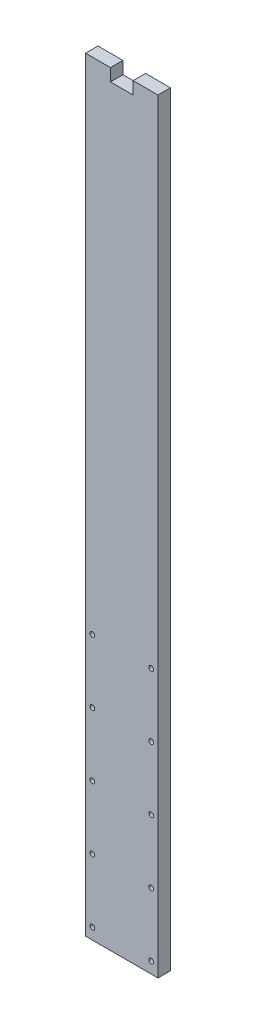
ISO-10303-21;
HEADER;
FILE_DESCRIPTION(('STEP AP214'),'2;1');
FILE_NAME('part.step','',(''),(''),'','','');
FILE_SCHEMA(('AUTOMOTIVE_DESIGN { 1 0 10303 214 1 1 1 1 }'));
ENDSEC;
DATA;
#1=APPLICATION_CONTEXT('core data for automotive mechanical design processes');
#2=APPLICATION_PROTOCOL_DEFINITION('international standard','automotive_design',2000,#1);
#3=PRODUCT_CONTEXT('',#1,'mechanical');
#4=PRODUCT('Part','Part','',(#3));
#5=PRODUCT_RELATED_PRODUCT_CATEGORY('part','',(#4));
#6=PRODUCT_DEFINITION_FORMATION('','',#4);
#7=PRODUCT_DEFINITION_CONTEXT('part definition',#1,'design');
#8=PRODUCT_DEFINITION('design','',#6,#7);
#9=PRODUCT_DEFINITION_SHAPE('','',#8);
#10=(LENGTH_UNIT() NAMED_UNIT(*) SI_UNIT(.MILLI.,.METRE.));
#11=(NAMED_UNIT(*) PLANE_ANGLE_UNIT() SI_UNIT($,.RADIAN.));
#12=(NAMED_UNIT(*) SI_UNIT($,.STERADIAN.) SOLID_ANGLE_UNIT());
#13=UNCERTAINTY_MEASURE_WITH_UNIT(LENGTH_MEASURE(1.E-05),#10,'distance_accuracy_value','');
#14=(GEOMETRIC_REPRESENTATION_CONTEXT(3) GLOBAL_UNCERTAINTY_ASSIGNED_CONTEXT((#13)) GLOBAL_UNIT_ASSIGNED_CONTEXT((#10,
#11,#12)) REPRESENTATION_CONTEXT('',''));
#15=CARTESIAN_POINT('',(0.,0.,0.));
#16=DIRECTION('',(0.,0.,1.));
#17=DIRECTION('',(1.,0.,0.));
#18=AXIS2_PLACEMENT_3D('',#15,#16,#17);
#19=CARTESIAN_POINT('',(0.,338.,5.5));
#20=DIRECTION('',(0.,-1.,0.));
#21=DIRECTION('',(0.,0.,-1.));
#22=AXIS2_PLACEMENT_3D('',#19,#20,#21);
#23=PLANE('',#22);
#24=DIRECTION('',(-1.,0.,0.));
#25=VECTOR('',#24,1.);
#26=CARTESIAN_POINT('',(0.,338.,0.));
#27=LINE('',#26,#25);
#28=CARTESIAN_POINT('',(32.,338.,0.));
#29=VERTEX_POINT('',#28);
#30=CARTESIAN_POINT('',(20.9999999999999,338.,0.));
#31=VERTEX_POINT('',#30);
#32=EDGE_CURVE('E126',#29,#31,#27,.T.);
#33=ORIENTED_EDGE('',*,*,#32,.T.);
#34=DIRECTION('',(0.,0.,1.));
#35=VECTOR('',#34,1.);
#36=CARTESIAN_POINT('',(20.9999999999999,338.,0.));
#37=LINE('',#36,#35);
#38=CARTESIAN_POINT('',(20.9999999999999,338.,5.5));
#39=VERTEX_POINT('',#38);
#40=EDGE_CURVE('E110',#31,#39,#37,.T.);
#41=ORIENTED_EDGE('',*,*,#40,.T.);
#42=DIRECTION('',(-1.,0.,0.));
#43=VECTOR('',#42,1.);
#44=CARTESIAN_POINT('',(0.,338.,5.5));
#45=LINE('',#44,#43);
#46=CARTESIAN_POINT('',(32.,338.,5.5));
#47=VERTEX_POINT('',#46);
#48=EDGE_CURVE('E143',#47,#39,#45,.T.);
#49=ORIENTED_EDGE('',*,*,#48,.F.);
#50=DIRECTION('',(0.,0.,-1.));
#51=VECTOR('',#50,1.);
#52=CARTESIAN_POINT('',(32.,338.,5.5));
#53=LINE('',#52,#51);
#54=EDGE_CURVE('E133',#47,#29,#53,.T.);
#55=ORIENTED_EDGE('',*,*,#54,.T.);
#56=EDGE_LOOP('',(#33,#41,#49,#55));
#57=FACE_BOUND('',#56,.T.);
#58=ADVANCED_FACE('F33',(#57),#23,.F.);
#59=CARTESIAN_POINT('',(0.,0.,5.5));
#60=DIRECTION('',(1.,0.,0.));
#61=DIRECTION('',(0.,0.,-1.));
#62=AXIS2_PLACEMENT_3D('',#59,#60,#61);
#63=PLANE('',#62);
#64=DIRECTION('',(0.,-1.,0.));
#65=VECTOR('',#64,1.);
#66=CARTESIAN_POINT('',(0.,0.,0.));
#67=LINE('',#66,#65);
#68=CARTESIAN_POINT('',(0.,338.,0.));
#69=VERTEX_POINT('',#68);
#70=CARTESIAN_POINT('',(0.,0.,0.));
#71=VERTEX_POINT('',#70);
#72=EDGE_CURVE('E189',#69,#71,#67,.T.);
#73=ORIENTED_EDGE('',*,*,#72,.T.);
#74=DIRECTION('',(0.,0.,-1.));
#75=VECTOR('',#74,1.);
#76=CARTESIAN_POINT('',(0.,0.,5.5));
#77=LINE('',#76,#75);
#78=CARTESIAN_POINT('',(0.,0.,5.5));
#79=VERTEX_POINT('',#78);
#80=EDGE_CURVE('E11',#79,#71,#77,.T.);
#81=ORIENTED_EDGE('',*,*,#80,.F.);
#82=DIRECTION('',(0.,-1.,0.));
#83=VECTOR('',#82,1.);
#84=CARTESIAN_POINT('',(0.,0.,5.5));
#85=LINE('',#84,#83);
#86=CARTESIAN_POINT('',(0.,338.,5.5));
#87=VERTEX_POINT('',#86);
#88=EDGE_CURVE('E134',#87,#79,#85,.T.);
#89=ORIENTED_EDGE('',*,*,#88,.F.);
#90=DIRECTION('',(0.,0.,-1.));
#91=VECTOR('',#90,1.);
#92=CARTESIAN_POINT('',(0.,338.,5.5));
#93=LINE('',#92,#91);
#94=EDGE_CURVE('E141',#87,#69,#93,.T.);
#95=ORIENTED_EDGE('',*,*,#94,.T.);
#96=EDGE_LOOP('',(#73,#81,#89,#95));
#97=FACE_BOUND('',#96,.T.);
#98=ADVANCED_FACE('F35',(#97),#63,.F.);
#99=CARTESIAN_POINT('',(0.,0.,5.5));
#100=DIRECTION('',(0.,1.,0.));
#101=DIRECTION('',(0.,0.,1.));
#102=AXIS2_PLACEMENT_3D('',#99,#100,#101);
#103=PLANE('',#102);
#104=DIRECTION('',(1.,0.,0.));
#105=VECTOR('',#104,1.);
#106=CARTESIAN_POINT('',(0.,0.,0.));
#107=LINE('',#106,#105);
#108=CARTESIAN_POINT('',(32.,0.,0.));
#109=VERTEX_POINT('',#108);
#110=EDGE_CURVE('E198',#71,#109,#107,.T.);
#111=ORIENTED_EDGE('',*,*,#110,.T.);
#112=DIRECTION('',(0.,0.,-1.));
#113=VECTOR('',#112,1.);
#114=CARTESIAN_POINT('',(32.,0.,5.5));
#115=LINE('',#114,#113);
#116=CARTESIAN_POINT('',(32.,0.,5.5));
#117=VERTEX_POINT('',#116);
#118=EDGE_CURVE('E42',#117,#109,#115,.T.);
#119=ORIENTED_EDGE('',*,*,#118,.F.);
#120=DIRECTION('',(1.,0.,0.));
#121=VECTOR('',#120,1.);
#122=CARTESIAN_POINT('',(0.,0.,5.5));
#123=LINE('',#122,#121);
#124=EDGE_CURVE('E88',#79,#117,#123,.T.);
#125=ORIENTED_EDGE('',*,*,#124,.F.);
#126=ORIENTED_EDGE('',*,*,#80,.T.);
#127=EDGE_LOOP('',(#111,#119,#125,#126));
#128=FACE_BOUND('',#127,.T.);
#129=ADVANCED_FACE('F204',(#128),#103,.F.);
#130=CARTESIAN_POINT('',(32.,0.,5.5));
#131=DIRECTION('',(-1.,0.,0.));
#132=DIRECTION('',(0.,0.,1.));
#133=AXIS2_PLACEMENT_3D('',#130,#131,#132);
#134=PLANE('',#133);
#135=DIRECTION('',(0.,1.,0.));
#136=VECTOR('',#135,1.);
#137=CARTESIAN_POINT('',(32.,0.,0.));
#138=LINE('',#137,#136);
#139=EDGE_CURVE('E137',#109,#29,#138,.T.);
#140=ORIENTED_EDGE('',*,*,#139,.T.);
#141=ORIENTED_EDGE('',*,*,#54,.F.);
#142=DIRECTION('',(0.,1.,0.));
#143=VECTOR('',#142,1.);
#144=CARTESIAN_POINT('',(32.,0.,5.5));
#145=LINE('',#144,#143);
#146=EDGE_CURVE('E194',#117,#47,#145,.T.);
#147=ORIENTED_EDGE('',*,*,#146,.F.);
#148=ORIENTED_EDGE('',*,*,#118,.T.);
#149=EDGE_LOOP('',(#140,#141,#147,#148));
#150=FACE_BOUND('',#149,.T.);
#151=ADVANCED_FACE('F200',(#150),#134,.F.);
#152=CARTESIAN_POINT('',(10.9999999999999,338.,5.5));
#153=VERTEX_POINT('',#152);
#154=EDGE_CURVE('E59',#153,#87,#45,.T.);
#155=ORIENTED_EDGE('',*,*,#154,.F.);
#156=DIRECTION('',(0.,0.,1.));
#157=VECTOR('',#156,1.);
#158=CARTESIAN_POINT('',(10.9999999999999,338.,0.));
#159=LINE('',#158,#157);
#160=CARTESIAN_POINT('',(10.9999999999999,338.,0.));
#161=VERTEX_POINT('',#160);
#162=EDGE_CURVE('E120',#161,#153,#159,.T.);
#163=ORIENTED_EDGE('',*,*,#162,.F.);
#164=EDGE_CURVE('E81',#161,#69,#27,.T.);
#165=ORIENTED_EDGE('',*,*,#164,.T.);
#166=ORIENTED_EDGE('',*,*,#94,.F.);
#167=EDGE_LOOP('',(#155,#163,#165,#166));
#168=FACE_BOUND('',#167,.T.);
#169=ADVANCED_FACE('F207',(#168),#23,.F.);
#170=CARTESIAN_POINT('',(0.,0.,5.5));
#171=DIRECTION('',(0.,0.,-1.));
#172=DIRECTION('',(-1.,0.,0.));
#173=AXIS2_PLACEMENT_3D('',#170,#171,#172);
#174=PLANE('',#173);
#175=CARTESIAN_POINT('',(29.,61.,5.5));
#176=DIRECTION('',(0.,0.,1.));
#177=DIRECTION('',(1.,0.,0.));
#178=AXIS2_PLACEMENT_3D('',#175,#176,#177);
#179=CIRCLE('',#178,1.05);
#180=CARTESIAN_POINT('',(30.05,61.,5.5));
#181=VERTEX_POINT('',#180);
#182=EDGE_CURVE('E222',#181,#181,#179,.T.);
#183=ORIENTED_EDGE('',*,*,#182,.F.);
#184=EDGE_LOOP('',(#183));
#185=FACE_BOUND('',#184,.T.);
#186=CARTESIAN_POINT('',(3.,89.,5.5));
#187=DIRECTION('',(0.,0.,1.));
#188=DIRECTION('',(1.,0.,0.));
#189=AXIS2_PLACEMENT_3D('',#186,#187,#188);
#190=CIRCLE('',#189,1.05);
#191=CARTESIAN_POINT('',(4.05,89.,5.5));
#192=VERTEX_POINT('',#191);
#193=EDGE_CURVE('E225',#192,#192,#190,.T.);
#194=ORIENTED_EDGE('',*,*,#193,.F.);
#195=EDGE_LOOP('',(#194));
#196=FACE_BOUND('',#195,.T.);
#197=CARTESIAN_POINT('',(29.,89.,5.5));
#198=DIRECTION('',(0.,0.,1.));
#199=DIRECTION('',(1.,0.,0.));
#200=AXIS2_PLACEMENT_3D('',#197,#198,#199);
#201=CIRCLE('',#200,1.05);
#202=CARTESIAN_POINT('',(30.05,89.,5.5));
#203=VERTEX_POINT('',#202);
#204=EDGE_CURVE('E228',#203,#203,#201,.T.);
#205=ORIENTED_EDGE('',*,*,#204,.F.);
#206=EDGE_LOOP('',(#205));
#207=FACE_BOUND('',#206,.T.);
#208=CARTESIAN_POINT('',(3.,117.,5.5));
#209=DIRECTION('',(0.,0.,1.));
#210=DIRECTION('',(1.,0.,0.));
#211=AXIS2_PLACEMENT_3D('',#208,#209,#210);
#212=CIRCLE('',#211,1.05);
#213=CARTESIAN_POINT('',(4.05,117.,5.5));
#214=VERTEX_POINT('',#213);
#215=EDGE_CURVE('E231',#214,#214,#212,.T.);
#216=ORIENTED_EDGE('',*,*,#215,.F.);
#217=EDGE_LOOP('',(#216));
#218=FACE_BOUND('',#217,.T.);
#219=CARTESIAN_POINT('',(29.,5.,5.5));
#220=DIRECTION('',(0.,0.,1.));
#221=DIRECTION('',(1.,0.,0.));
#222=AXIS2_PLACEMENT_3D('',#219,#220,#221);
#223=CIRCLE('',#222,1.05);
#224=CARTESIAN_POINT('',(30.05,5.,5.5));
#225=VERTEX_POINT('',#224);
#226=EDGE_CURVE('E212',#225,#225,#223,.T.);
#227=ORIENTED_EDGE('',*,*,#226,.F.);
#228=EDGE_LOOP('',(#227));
#229=FACE_BOUND('',#228,.T.);
#230=CARTESIAN_POINT('',(3.,33.,5.5));
#231=DIRECTION('',(0.,0.,1.));
#232=DIRECTION('',(1.,0.,0.));
#233=AXIS2_PLACEMENT_3D('',#230,#231,#232);
#234=CIRCLE('',#233,1.05);
#235=CARTESIAN_POINT('',(4.05,33.,5.5));
#236=VERTEX_POINT('',#235);
#237=EDGE_CURVE('E213',#236,#236,#234,.T.);
#238=ORIENTED_EDGE('',*,*,#237,.F.);
#239=EDGE_LOOP('',(#238));
#240=FACE_BOUND('',#239,.T.);
#241=CARTESIAN_POINT('',(29.,33.,5.5));
#242=DIRECTION('',(0.,0.,1.));
#243=DIRECTION('',(1.,0.,0.));
#244=AXIS2_PLACEMENT_3D('',#241,#242,#243);
#245=CIRCLE('',#244,1.05);
#246=CARTESIAN_POINT('',(30.05,33.,5.5));
#247=VERTEX_POINT('',#246);
#248=EDGE_CURVE('E216',#247,#247,#245,.T.);
#249=ORIENTED_EDGE('',*,*,#248,.F.);
#250=EDGE_LOOP('',(#249));
#251=FACE_BOUND('',#250,.T.);
#252=CARTESIAN_POINT('',(3.,61.,5.5));
#253=DIRECTION('',(0.,0.,1.));
#254=DIRECTION('',(1.,0.,0.));
#255=AXIS2_PLACEMENT_3D('',#252,#253,#254);
#256=CIRCLE('',#255,1.05);
#257=CARTESIAN_POINT('',(4.05,61.,5.5));
#258=VERTEX_POINT('',#257);
#259=EDGE_CURVE('E219',#258,#258,#256,.T.);
#260=ORIENTED_EDGE('',*,*,#259,.F.);
#261=EDGE_LOOP('',(#260));
#262=FACE_BOUND('',#261,.T.);
#263=CARTESIAN_POINT('',(29.,117.,5.5));
#264=DIRECTION('',(0.,0.,1.));
#265=DIRECTION('',(1.,0.,0.));
#266=AXIS2_PLACEMENT_3D('',#263,#264,#265);
#267=CIRCLE('',#266,1.05);
#268=CARTESIAN_POINT('',(30.05,117.,5.5));
#269=VERTEX_POINT('',#268);
#270=EDGE_CURVE('E234',#269,#269,#267,.T.);
#271=ORIENTED_EDGE('',*,*,#270,.F.);
#272=EDGE_LOOP('',(#271));
#273=FACE_BOUND('',#272,.T.);
#274=CARTESIAN_POINT('',(3.,5.,5.5));
#275=DIRECTION('',(0.,0.,1.));
#276=DIRECTION('',(1.,0.,0.));
#277=AXIS2_PLACEMENT_3D('',#274,#275,#276);
#278=CIRCLE('',#277,1.05);
#279=CARTESIAN_POINT('',(4.05,5.,5.5));
#280=VERTEX_POINT('',#279);
#281=EDGE_CURVE('E151',#280,#280,#278,.T.);
#282=ORIENTED_EDGE('',*,*,#281,.F.);
#283=EDGE_LOOP('',(#282));
#284=FACE_BOUND('',#283,.T.);
#285=ORIENTED_EDGE('',*,*,#48,.T.);
#286=DIRECTION('',(0.,1.,0.));
#287=VECTOR('',#286,1.);
#288=CARTESIAN_POINT('',(20.9999999999999,332.5,5.5));
#289=LINE('',#288,#287);
#290=CARTESIAN_POINT('',(20.9999999999999,332.5,5.5));
#291=VERTEX_POINT('',#290);
#292=EDGE_CURVE('E115',#291,#39,#289,.T.);
#293=ORIENTED_EDGE('',*,*,#292,.F.);
#294=DIRECTION('',(1.,0.,0.));
#295=VECTOR('',#294,1.);
#296=CARTESIAN_POINT('',(10.9999999999999,332.5,5.5));
#297=LINE('',#296,#295);
#298=CARTESIAN_POINT('',(10.9999999999999,332.5,5.5));
#299=VERTEX_POINT('',#298);
#300=EDGE_CURVE('E129',#299,#291,#297,.T.);
#301=ORIENTED_EDGE('',*,*,#300,.F.);
#302=DIRECTION('',(0.,-1.,0.));
#303=VECTOR('',#302,1.);
#304=CARTESIAN_POINT('',(10.9999999999999,332.5,5.5));
#305=LINE('',#304,#303);
#306=EDGE_CURVE('E178',#153,#299,#305,.T.);
#307=ORIENTED_EDGE('',*,*,#306,.F.);
#308=ORIENTED_EDGE('',*,*,#154,.T.);
#309=ORIENTED_EDGE('',*,*,#88,.T.);
#310=ORIENTED_EDGE('',*,*,#124,.T.);
#311=ORIENTED_EDGE('',*,*,#146,.T.);
#312=EDGE_LOOP('',(#285,#293,#301,#307,#308,#309,#310,#311));
#313=FACE_BOUND('',#312,.T.);
#314=ADVANCED_FACE('F242',(#185,#196,#207,#218,#229,#240,#251,#262,#273,#284,#313),#174,.F.);
#315=CARTESIAN_POINT('',(0.,0.,0.));
#316=DIRECTION('',(0.,0.,-1.));
#317=DIRECTION('',(-1.,0.,0.));
#318=AXIS2_PLACEMENT_3D('',#315,#316,#317);
#319=PLANE('',#318);
#320=CARTESIAN_POINT('',(29.,61.,0.));
#321=DIRECTION('',(0.,0.,-1.));
#322=DIRECTION('',(-1.,0.,0.));
#323=AXIS2_PLACEMENT_3D('',#320,#321,#322);
#324=CIRCLE('',#323,1.05);
#325=CARTESIAN_POINT('',(27.95,61.,0.));
#326=VERTEX_POINT('',#325);
#327=EDGE_CURVE('E37',#326,#326,#324,.T.);
#328=ORIENTED_EDGE('',*,*,#327,.F.);
#329=EDGE_LOOP('',(#328));
#330=FACE_BOUND('',#329,.T.);
#331=CARTESIAN_POINT('',(3.,89.,0.));
#332=DIRECTION('',(0.,0.,-1.));
#333=DIRECTION('',(-1.,0.,0.));
#334=AXIS2_PLACEMENT_3D('',#331,#332,#333);
#335=CIRCLE('',#334,1.05);
#336=CARTESIAN_POINT('',(1.95,89.,0.));
#337=VERTEX_POINT('',#336);
#338=EDGE_CURVE('E171',#337,#337,#335,.T.);
#339=ORIENTED_EDGE('',*,*,#338,.F.);
#340=EDGE_LOOP('',(#339));
#341=FACE_BOUND('',#340,.T.);
#342=CARTESIAN_POINT('',(29.,89.,0.));
#343=DIRECTION('',(0.,0.,-1.));
#344=DIRECTION('',(-1.,0.,0.));
#345=AXIS2_PLACEMENT_3D('',#342,#343,#344);
#346=CIRCLE('',#345,1.05);
#347=CARTESIAN_POINT('',(27.95,89.,0.));
#348=VERTEX_POINT('',#347);
#349=EDGE_CURVE('E169',#348,#348,#346,.T.);
#350=ORIENTED_EDGE('',*,*,#349,.F.);
#351=EDGE_LOOP('',(#350));
#352=FACE_BOUND('',#351,.T.);
#353=CARTESIAN_POINT('',(3.,117.,0.));
#354=DIRECTION('',(0.,0.,-1.));
#355=DIRECTION('',(-1.,0.,0.));
#356=AXIS2_PLACEMENT_3D('',#353,#354,#355);
#357=CIRCLE('',#356,1.05);
#358=CARTESIAN_POINT('',(1.95,117.,0.));
#359=VERTEX_POINT('',#358);
#360=EDGE_CURVE('E166',#359,#359,#357,.T.);
#361=ORIENTED_EDGE('',*,*,#360,.F.);
#362=EDGE_LOOP('',(#361));
#363=FACE_BOUND('',#362,.T.);
#364=CARTESIAN_POINT('',(29.,5.,0.));
#365=DIRECTION('',(0.,0.,-1.));
#366=DIRECTION('',(-1.,0.,0.));
#367=AXIS2_PLACEMENT_3D('',#364,#365,#366);
#368=CIRCLE('',#367,1.05);
#369=CARTESIAN_POINT('',(27.95,5.,0.));
#370=VERTEX_POINT('',#369);
#371=EDGE_CURVE('E163',#370,#370,#368,.T.);
#372=ORIENTED_EDGE('',*,*,#371,.F.);
#373=EDGE_LOOP('',(#372));
#374=FACE_BOUND('',#373,.T.);
#375=CARTESIAN_POINT('',(3.,33.,0.));
#376=DIRECTION('',(0.,0.,-1.));
#377=DIRECTION('',(-1.,0.,0.));
#378=AXIS2_PLACEMENT_3D('',#375,#376,#377);
#379=CIRCLE('',#378,1.05);
#380=CARTESIAN_POINT('',(1.95,33.,0.));
#381=VERTEX_POINT('',#380);
#382=EDGE_CURVE('E160',#381,#381,#379,.T.);
#383=ORIENTED_EDGE('',*,*,#382,.F.);
#384=EDGE_LOOP('',(#383));
#385=FACE_BOUND('',#384,.T.);
#386=CARTESIAN_POINT('',(29.,33.,0.));
#387=DIRECTION('',(0.,0.,-1.));
#388=DIRECTION('',(-1.,0.,0.));
#389=AXIS2_PLACEMENT_3D('',#386,#387,#388);
#390=CIRCLE('',#389,1.05);
#391=CARTESIAN_POINT('',(27.95,33.,0.));
#392=VERTEX_POINT('',#391);
#393=EDGE_CURVE('E157',#392,#392,#390,.T.);
#394=ORIENTED_EDGE('',*,*,#393,.F.);
#395=EDGE_LOOP('',(#394));
#396=FACE_BOUND('',#395,.T.);
#397=CARTESIAN_POINT('',(3.,61.,0.));
#398=DIRECTION('',(0.,0.,-1.));
#399=DIRECTION('',(-1.,0.,0.));
#400=AXIS2_PLACEMENT_3D('',#397,#398,#399);
#401=CIRCLE('',#400,1.05);
#402=CARTESIAN_POINT('',(1.95,61.,0.));
#403=VERTEX_POINT('',#402);
#404=EDGE_CURVE('E154',#403,#403,#401,.T.);
#405=ORIENTED_EDGE('',*,*,#404,.F.);
#406=EDGE_LOOP('',(#405));
#407=FACE_BOUND('',#406,.T.);
#408=CARTESIAN_POINT('',(29.,117.,0.));
#409=DIRECTION('',(0.,0.,-1.));
#410=DIRECTION('',(-1.,0.,0.));
#411=AXIS2_PLACEMENT_3D('',#408,#409,#410);
#412=CIRCLE('',#411,1.05);
#413=CARTESIAN_POINT('',(27.95,117.,0.));
#414=VERTEX_POINT('',#413);
#415=EDGE_CURVE('E150',#414,#414,#412,.T.);
#416=ORIENTED_EDGE('',*,*,#415,.F.);
#417=EDGE_LOOP('',(#416));
#418=FACE_BOUND('',#417,.T.);
#419=CARTESIAN_POINT('',(3.,5.,0.));
#420=DIRECTION('',(0.,0.,-1.));
#421=DIRECTION('',(-1.,0.,0.));
#422=AXIS2_PLACEMENT_3D('',#419,#420,#421);
#423=CIRCLE('',#422,1.05);
#424=CARTESIAN_POINT('',(1.95,5.,0.));
#425=VERTEX_POINT('',#424);
#426=EDGE_CURVE('E147',#425,#425,#423,.T.);
#427=ORIENTED_EDGE('',*,*,#426,.F.);
#428=EDGE_LOOP('',(#427));
#429=FACE_BOUND('',#428,.T.);
#430=DIRECTION('',(0.,1.,0.));
#431=VECTOR('',#430,1.);
#432=CARTESIAN_POINT('',(20.9999999999999,332.5,0.));
#433=LINE('',#432,#431);
#434=CARTESIAN_POINT('',(20.9999999999999,332.5,0.));
#435=VERTEX_POINT('',#434);
#436=EDGE_CURVE('E113',#435,#31,#433,.T.);
#437=ORIENTED_EDGE('',*,*,#436,.T.);
#438=ORIENTED_EDGE('',*,*,#32,.F.);
#439=ORIENTED_EDGE('',*,*,#139,.F.);
#440=ORIENTED_EDGE('',*,*,#110,.F.);
#441=ORIENTED_EDGE('',*,*,#72,.F.);
#442=ORIENTED_EDGE('',*,*,#164,.F.);
#443=DIRECTION('',(0.,-1.,0.));
#444=VECTOR('',#443,1.);
#445=CARTESIAN_POINT('',(10.9999999999999,332.5,0.));
#446=LINE('',#445,#444);
#447=CARTESIAN_POINT('',(10.9999999999999,332.5,0.));
#448=VERTEX_POINT('',#447);
#449=EDGE_CURVE('E128',#161,#448,#446,.T.);
#450=ORIENTED_EDGE('',*,*,#449,.T.);
#451=DIRECTION('',(1.,0.,0.));
#452=VECTOR('',#451,1.);
#453=CARTESIAN_POINT('',(10.9999999999999,332.5,0.));
#454=LINE('',#453,#452);
#455=EDGE_CURVE('E50',#448,#435,#454,.T.);
#456=ORIENTED_EDGE('',*,*,#455,.T.);
#457=EDGE_LOOP('',(#437,#438,#439,#440,#441,#442,#450,#456));
#458=FACE_BOUND('',#457,.T.);
#459=ADVANCED_FACE('F124',(#330,#341,#352,#363,#374,#385,#396,#407,#418,#429,#458),#319,.T.);
#460=CARTESIAN_POINT('',(20.9999999999999,332.5,0.));
#461=DIRECTION('',(1.,0.,0.));
#462=DIRECTION('',(0.,1.,0.));
#463=AXIS2_PLACEMENT_3D('',#460,#461,#462);
#464=PLANE('',#463);
#465=ORIENTED_EDGE('',*,*,#292,.T.);
#466=ORIENTED_EDGE('',*,*,#40,.F.);
#467=ORIENTED_EDGE('',*,*,#436,.F.);
#468=DIRECTION('',(0.,0.,1.));
#469=VECTOR('',#468,1.);
#470=CARTESIAN_POINT('',(20.9999999999999,332.5,0.));
#471=LINE('',#470,#469);
#472=EDGE_CURVE('E187',#435,#291,#471,.T.);
#473=ORIENTED_EDGE('',*,*,#472,.T.);
#474=EDGE_LOOP('',(#465,#466,#467,#473));
#475=FACE_BOUND('',#474,.T.);
#476=ADVANCED_FACE('F112',(#475),#464,.F.);
#477=CARTESIAN_POINT('',(10.9999999999999,332.5,0.));
#478=DIRECTION('',(0.,-1.,0.));
#479=DIRECTION('',(0.,0.,-1.));
#480=AXIS2_PLACEMENT_3D('',#477,#478,#479);
#481=PLANE('',#480);
#482=ORIENTED_EDGE('',*,*,#300,.T.);
#483=ORIENTED_EDGE('',*,*,#472,.F.);
#484=ORIENTED_EDGE('',*,*,#455,.F.);
#485=DIRECTION('',(0.,0.,1.));
#486=VECTOR('',#485,1.);
#487=CARTESIAN_POINT('',(10.9999999999999,332.5,0.));
#488=LINE('',#487,#486);
#489=EDGE_CURVE('E190',#448,#299,#488,.T.);
#490=ORIENTED_EDGE('',*,*,#489,.T.);
#491=EDGE_LOOP('',(#482,#483,#484,#490));
#492=FACE_BOUND('',#491,.T.);
#493=ADVANCED_FACE('F249',(#492),#481,.F.);
#494=CARTESIAN_POINT('',(10.9999999999999,332.5,0.));
#495=DIRECTION('',(-1.,0.,0.));
#496=DIRECTION('',(0.,0.,1.));
#497=AXIS2_PLACEMENT_3D('',#494,#495,#496);
#498=PLANE('',#497);
#499=ORIENTED_EDGE('',*,*,#306,.T.);
#500=ORIENTED_EDGE('',*,*,#489,.F.);
#501=ORIENTED_EDGE('',*,*,#449,.F.);
#502=ORIENTED_EDGE('',*,*,#162,.T.);
#503=EDGE_LOOP('',(#499,#500,#501,#502));
#504=FACE_BOUND('',#503,.T.);
#505=ADVANCED_FACE('F250',(#504),#498,.F.);
#506=CARTESIAN_POINT('',(3.,5.,-4.5));
#507=DIRECTION('',(0.,0.,1.));
#508=DIRECTION('',(1.,0.,0.));
#509=AXIS2_PLACEMENT_3D('',#506,#507,#508);
#510=CYLINDRICAL_SURFACE('',#509,1.05);
#511=ORIENTED_EDGE('',*,*,#426,.T.);
#512=EDGE_LOOP('',(#511));
#513=FACE_BOUND('',#512,.T.);
#514=ORIENTED_EDGE('',*,*,#281,.T.);
#515=EDGE_LOOP('',(#514));
#516=FACE_BOUND('',#515,.T.);
#517=ADVANCED_FACE('F252',(#513,#516),#510,.F.);
#518=CARTESIAN_POINT('',(29.,117.,-4.5));
#519=DIRECTION('',(0.,0.,1.));
#520=DIRECTION('',(1.,0.,0.));
#521=AXIS2_PLACEMENT_3D('',#518,#519,#520);
#522=CYLINDRICAL_SURFACE('',#521,1.05);
#523=ORIENTED_EDGE('',*,*,#415,.T.);
#524=EDGE_LOOP('',(#523));
#525=FACE_BOUND('',#524,.T.);
#526=ORIENTED_EDGE('',*,*,#270,.T.);
#527=EDGE_LOOP('',(#526));
#528=FACE_BOUND('',#527,.T.);
#529=ADVANCED_FACE('F240',(#525,#528),#522,.F.);
#530=CARTESIAN_POINT('',(3.,61.,-4.5));
#531=DIRECTION('',(0.,0.,1.));
#532=DIRECTION('',(1.,0.,0.));
#533=AXIS2_PLACEMENT_3D('',#530,#531,#532);
#534=CYLINDRICAL_SURFACE('',#533,1.05);
#535=ORIENTED_EDGE('',*,*,#404,.T.);
#536=EDGE_LOOP('',(#535));
#537=FACE_BOUND('',#536,.T.);
#538=ORIENTED_EDGE('',*,*,#259,.T.);
#539=EDGE_LOOP('',(#538));
#540=FACE_BOUND('',#539,.T.);
#541=ADVANCED_FACE('F338',(#537,#540),#534,.F.);
#542=CARTESIAN_POINT('',(29.,33.,-4.5));
#543=DIRECTION('',(0.,0.,1.));
#544=DIRECTION('',(1.,0.,0.));
#545=AXIS2_PLACEMENT_3D('',#542,#543,#544);
#546=CYLINDRICAL_SURFACE('',#545,1.05);
#547=ORIENTED_EDGE('',*,*,#393,.T.);
#548=EDGE_LOOP('',(#547));
#549=FACE_BOUND('',#548,.T.);
#550=ORIENTED_EDGE('',*,*,#248,.T.);
#551=EDGE_LOOP('',(#550));
#552=FACE_BOUND('',#551,.T.);
#553=ADVANCED_FACE('F347',(#549,#552),#546,.F.);
#554=CARTESIAN_POINT('',(3.,33.,-4.5));
#555=DIRECTION('',(0.,0.,1.));
#556=DIRECTION('',(1.,0.,0.));
#557=AXIS2_PLACEMENT_3D('',#554,#555,#556);
#558=CYLINDRICAL_SURFACE('',#557,1.05);
#559=ORIENTED_EDGE('',*,*,#382,.T.);
#560=EDGE_LOOP('',(#559));
#561=FACE_BOUND('',#560,.T.);
#562=ORIENTED_EDGE('',*,*,#237,.T.);
#563=EDGE_LOOP('',(#562));
#564=FACE_BOUND('',#563,.T.);
#565=ADVANCED_FACE('F356',(#561,#564),#558,.F.);
#566=CARTESIAN_POINT('',(29.,5.,-4.5));
#567=DIRECTION('',(0.,0.,1.));
#568=DIRECTION('',(1.,0.,0.));
#569=AXIS2_PLACEMENT_3D('',#566,#567,#568);
#570=CYLINDRICAL_SURFACE('',#569,1.05);
#571=ORIENTED_EDGE('',*,*,#371,.T.);
#572=EDGE_LOOP('',(#571));
#573=FACE_BOUND('',#572,.T.);
#574=ORIENTED_EDGE('',*,*,#226,.T.);
#575=EDGE_LOOP('',(#574));
#576=FACE_BOUND('',#575,.T.);
#577=ADVANCED_FACE('F365',(#573,#576),#570,.F.);
#578=CARTESIAN_POINT('',(3.,117.,-4.5));
#579=DIRECTION('',(0.,0.,1.));
#580=DIRECTION('',(1.,0.,0.));
#581=AXIS2_PLACEMENT_3D('',#578,#579,#580);
#582=CYLINDRICAL_SURFACE('',#581,1.05);
#583=ORIENTED_EDGE('',*,*,#360,.T.);
#584=EDGE_LOOP('',(#583));
#585=FACE_BOUND('',#584,.T.);
#586=ORIENTED_EDGE('',*,*,#215,.T.);
#587=EDGE_LOOP('',(#586));
#588=FACE_BOUND('',#587,.T.);
#589=ADVANCED_FACE('F374',(#585,#588),#582,.F.);
#590=CARTESIAN_POINT('',(29.,89.,-4.5));
#591=DIRECTION('',(0.,0.,1.));
#592=DIRECTION('',(1.,0.,0.));
#593=AXIS2_PLACEMENT_3D('',#590,#591,#592);
#594=CYLINDRICAL_SURFACE('',#593,1.05);
#595=ORIENTED_EDGE('',*,*,#349,.T.);
#596=EDGE_LOOP('',(#595));
#597=FACE_BOUND('',#596,.T.);
#598=ORIENTED_EDGE('',*,*,#204,.T.);
#599=EDGE_LOOP('',(#598));
#600=FACE_BOUND('',#599,.T.);
#601=ADVANCED_FACE('F383',(#597,#600),#594,.F.);
#602=CARTESIAN_POINT('',(3.,89.,-4.5));
#603=DIRECTION('',(0.,0.,1.));
#604=DIRECTION('',(1.,0.,0.));
#605=AXIS2_PLACEMENT_3D('',#602,#603,#604);
#606=CYLINDRICAL_SURFACE('',#605,1.05);
#607=ORIENTED_EDGE('',*,*,#338,.T.);
#608=EDGE_LOOP('',(#607));
#609=FACE_BOUND('',#608,.T.);
#610=ORIENTED_EDGE('',*,*,#193,.T.);
#611=EDGE_LOOP('',(#610));
#612=FACE_BOUND('',#611,.T.);
#613=ADVANCED_FACE('F392',(#609,#612),#606,.F.);
#614=CARTESIAN_POINT('',(29.,61.,-4.5));
#615=DIRECTION('',(0.,0.,1.));
#616=DIRECTION('',(1.,0.,0.));
#617=AXIS2_PLACEMENT_3D('',#614,#615,#616);
#618=CYLINDRICAL_SURFACE('',#617,1.05);
#619=ORIENTED_EDGE('',*,*,#327,.T.);
#620=EDGE_LOOP('',(#619));
#621=FACE_BOUND('',#620,.T.);
#622=ORIENTED_EDGE('',*,*,#182,.T.);
#623=EDGE_LOOP('',(#622));
#624=FACE_BOUND('',#623,.T.);
#625=ADVANCED_FACE('F401',(#621,#624),#618,.F.);
#626=CLOSED_SHELL('',(#58,#98,#129,#151,#169,#314,#459,#476,#493,#505,#517,#529,#541,#553,#565,
#577,#589,#601,#613,#625));
#627=MANIFOLD_SOLID_BREP('B2',#626);
#628=ADVANCED_BREP_SHAPE_REPRESENTATION('',(#18,#627),#14);
#629=SHAPE_DEFINITION_REPRESENTATION(#9,#628);
ENDSEC;
END-ISO-10303-21;
